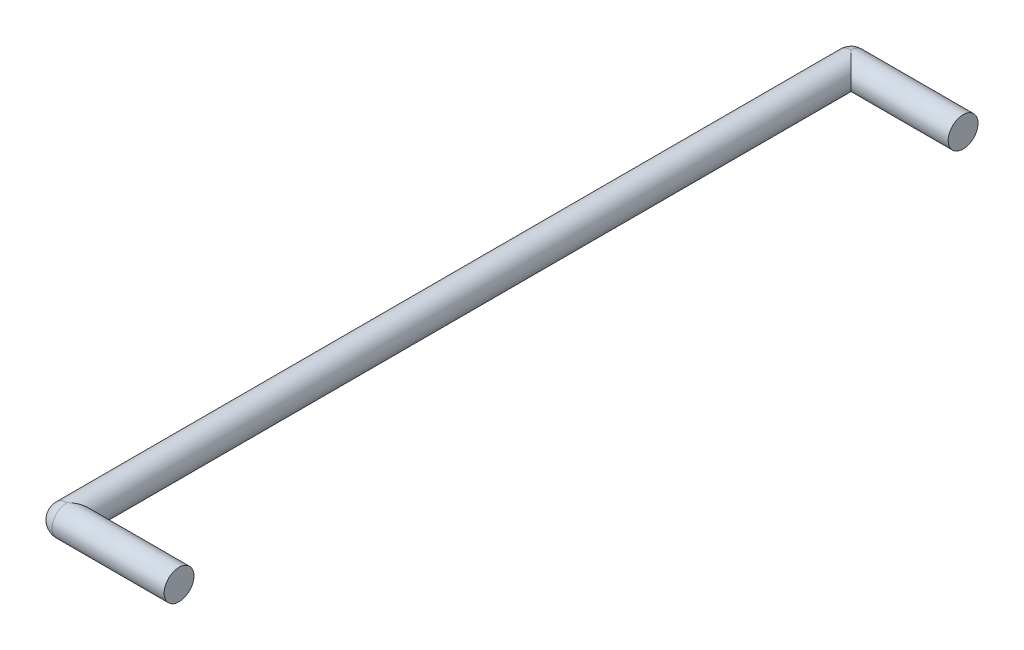
ISO-10303-21;
HEADER;
FILE_DESCRIPTION(('STEP AP214'),'2;1');
FILE_NAME('part.step','',(''),(''),'','','');
FILE_SCHEMA(('AUTOMOTIVE_DESIGN { 1 0 10303 214 1 1 1 1 }'));
ENDSEC;
DATA;
#1=APPLICATION_CONTEXT('core data for automotive mechanical design processes');
#2=APPLICATION_PROTOCOL_DEFINITION('international standard','automotive_design',2000,#1);
#3=PRODUCT_CONTEXT('',#1,'mechanical');
#4=PRODUCT('Part','Part','',(#3));
#5=PRODUCT_RELATED_PRODUCT_CATEGORY('part','',(#4));
#6=PRODUCT_DEFINITION_FORMATION('','',#4);
#7=PRODUCT_DEFINITION_CONTEXT('part definition',#1,'design');
#8=PRODUCT_DEFINITION('design','',#6,#7);
#9=PRODUCT_DEFINITION_SHAPE('','',#8);
#10=(LENGTH_UNIT() NAMED_UNIT(*) SI_UNIT(.MILLI.,.METRE.));
#11=(NAMED_UNIT(*) PLANE_ANGLE_UNIT() SI_UNIT($,.RADIAN.));
#12=(NAMED_UNIT(*) SI_UNIT($,.STERADIAN.) SOLID_ANGLE_UNIT());
#13=UNCERTAINTY_MEASURE_WITH_UNIT(LENGTH_MEASURE(1.E-05),#10,'distance_accuracy_value','');
#14=(GEOMETRIC_REPRESENTATION_CONTEXT(3) GLOBAL_UNCERTAINTY_ASSIGNED_CONTEXT((#13)) GLOBAL_UNIT_ASSIGNED_CONTEXT((#10,
#11,#12)) REPRESENTATION_CONTEXT('',''));
#15=CARTESIAN_POINT('',(0.,0.,0.));
#16=DIRECTION('',(0.,0.,1.));
#17=DIRECTION('',(1.,0.,0.));
#18=AXIS2_PLACEMENT_3D('',#15,#16,#17);
#19=CARTESIAN_POINT('',(3.,0.,0.));
#20=DIRECTION('',(1.,0.,0.));
#21=DIRECTION('',(0.,0.,-1.));
#22=AXIS2_PLACEMENT_3D('',#19,#20,#21);
#23=PLANE('',#22);
#24=CARTESIAN_POINT('',(3.,0.,0.));
#25=DIRECTION('',(-1.,0.,0.));
#26=DIRECTION('',(0.,0.,1.));
#27=AXIS2_PLACEMENT_3D('',#24,#25,#26);
#28=CIRCLE('',#27,0.4);
#29=CARTESIAN_POINT('',(3.,0.,0.4));
#30=VERTEX_POINT('',#29);
#31=EDGE_CURVE('E20',#30,#30,#28,.T.);
#32=ORIENTED_EDGE('',*,*,#31,.F.);
#33=EDGE_LOOP('',(#32));
#34=FACE_BOUND('',#33,.T.);
#35=ADVANCED_FACE('F17',(#34),#23,.T.);
#36=CARTESIAN_POINT('',(3.,0.,21.));
#37=DIRECTION('',(1.,0.,0.));
#38=DIRECTION('',(0.,0.,-1.));
#39=AXIS2_PLACEMENT_3D('',#36,#37,#38);
#40=PLANE('',#39);
#41=CARTESIAN_POINT('',(3.,0.,21.));
#42=DIRECTION('',(-1.,0.,0.));
#43=DIRECTION('',(0.,0.,1.));
#44=AXIS2_PLACEMENT_3D('',#41,#42,#43);
#45=CIRCLE('',#44,0.400000000000001);
#46=CARTESIAN_POINT('',(3.,0.,21.4));
#47=VERTEX_POINT('',#46);
#48=EDGE_CURVE('E60',#47,#47,#45,.T.);
#49=ORIENTED_EDGE('',*,*,#48,.F.);
#50=EDGE_LOOP('',(#49));
#51=FACE_BOUND('',#50,.T.);
#52=ADVANCED_FACE('F103',(#51),#40,.T.);
#53=CARTESIAN_POINT('',(3.,0.,0.));
#54=DIRECTION('',(-1.,0.,0.));
#55=DIRECTION('',(0.,0.,1.));
#56=AXIS2_PLACEMENT_3D('',#53,#54,#55);
#57=CYLINDRICAL_SURFACE('',#56,0.4);
#58=ORIENTED_EDGE('',*,*,#31,.T.);
#59=EDGE_LOOP('',(#58));
#60=FACE_BOUND('',#59,.T.);
#61=CARTESIAN_POINT('',(0.,0.,0.));
#62=DIRECTION('',(0.707106781186547,0.,-0.707106781186547));
#63=DIRECTION('',(-0.707106781186547,0.,-0.707106781186547));
#64=AXIS2_PLACEMENT_3D('',#61,#62,#63);
#65=ELLIPSE('',#64,0.565685424949238,0.4);
#66=CARTESIAN_POINT('',(0.,-0.4,0.));
#67=VERTEX_POINT('',#66);
#68=CARTESIAN_POINT('',(0.,0.4,0.));
#69=VERTEX_POINT('',#68);
#70=EDGE_CURVE('E55',#67,#69,#65,.F.);
#71=ORIENTED_EDGE('',*,*,#70,.F.);
#72=CARTESIAN_POINT('',(0.,0.,0.));
#73=DIRECTION('',(1.,0.,0.));
#74=DIRECTION('',(0.,1.,0.));
#75=AXIS2_PLACEMENT_3D('',#72,#73,#74);
#76=CIRCLE('',#75,0.4);
#77=EDGE_CURVE('E52',#69,#67,#76,.F.);
#78=ORIENTED_EDGE('',*,*,#77,.F.);
#79=EDGE_LOOP('',(#71,#78));
#80=FACE_BOUND('',#79,.T.);
#81=ADVANCED_FACE('F54',(#60,#80),#57,.T.);
#82=CARTESIAN_POINT('',(3.,0.,21.));
#83=DIRECTION('',(-1.,0.,0.));
#84=DIRECTION('',(0.,0.,1.));
#85=AXIS2_PLACEMENT_3D('',#82,#83,#84);
#86=CYLINDRICAL_SURFACE('',#85,0.400000000000001);
#87=CARTESIAN_POINT('',(0.,0.,21.));
#88=DIRECTION('',(1.,0.,0.));
#89=DIRECTION('',(0.,-1.,0.));
#90=AXIS2_PLACEMENT_3D('',#87,#88,#89);
#91=CIRCLE('',#90,0.400000000000001);
#92=CARTESIAN_POINT('',(0.,-0.400000000000001,21.));
#93=VERTEX_POINT('',#92);
#94=CARTESIAN_POINT('',(0.,0.400000000000001,21.));
#95=VERTEX_POINT('',#94);
#96=EDGE_CURVE('E48',#93,#95,#91,.F.);
#97=ORIENTED_EDGE('',*,*,#96,.F.);
#98=CARTESIAN_POINT('',(0.,0.,21.));
#99=DIRECTION('',(-0.707106781186547,0.,-0.707106781186547));
#100=DIRECTION('',(-0.707106781186547,0.,0.707106781186547));
#101=AXIS2_PLACEMENT_3D('',#98,#99,#100);
#102=ELLIPSE('',#101,0.565685424949239,0.400000000000001);
#103=EDGE_CURVE('E67',#95,#93,#102,.T.);
#104=ORIENTED_EDGE('',*,*,#103,.F.);
#105=EDGE_LOOP('',(#97,#104));
#106=FACE_BOUND('',#105,.T.);
#107=ORIENTED_EDGE('',*,*,#48,.T.);
#108=EDGE_LOOP('',(#107));
#109=FACE_BOUND('',#108,.T.);
#110=ADVANCED_FACE('F87',(#106,#109),#86,.T.);
#111=CARTESIAN_POINT('',(0.,0.,0.));
#112=DIRECTION('',(1.,0.,0.));
#113=DIRECTION('',(0.,1.,0.));
#114=AXIS2_PLACEMENT_3D('',#111,#112,#113);
#115=SPHERICAL_SURFACE('',#114,0.4);
#116=ORIENTED_EDGE('',*,*,#77,.T.);
#117=CARTESIAN_POINT('',(0.,0.,0.));
#118=DIRECTION('',(0.,0.,-1.));
#119=DIRECTION('',(-1.,0.,0.));
#120=AXIS2_PLACEMENT_3D('',#117,#118,#119);
#121=CIRCLE('',#120,0.4);
#122=CARTESIAN_POINT('',(-0.4,0.,0.));
#123=VERTEX_POINT('',#122);
#124=EDGE_CURVE('E59',#123,#67,#121,.F.);
#125=ORIENTED_EDGE('',*,*,#124,.F.);
#126=CARTESIAN_POINT('',(0.,0.,0.));
#127=DIRECTION('',(0.,0.,-1.));
#128=DIRECTION('',(-1.,0.,0.));
#129=AXIS2_PLACEMENT_3D('',#126,#127,#128);
#130=CIRCLE('',#129,0.4);
#131=EDGE_CURVE('E26',#69,#123,#130,.F.);
#132=ORIENTED_EDGE('',*,*,#131,.F.);
#133=EDGE_LOOP('',(#116,#125,#132));
#134=FACE_BOUND('',#133,.T.);
#135=ADVANCED_FACE('F66',(#134),#115,.T.);
#136=CARTESIAN_POINT('',(0.,0.,21.));
#137=DIRECTION('',(1.,0.,0.));
#138=DIRECTION('',(0.,-1.,0.));
#139=AXIS2_PLACEMENT_3D('',#136,#137,#138);
#140=SPHERICAL_SURFACE('',#139,0.400000000000001);
#141=CARTESIAN_POINT('',(0.,0.,21.));
#142=DIRECTION('',(0.,0.,-1.));
#143=DIRECTION('',(1.,0.,0.));
#144=AXIS2_PLACEMENT_3D('',#141,#142,#143);
#145=CIRCLE('',#144,0.400000000000001);
#146=CARTESIAN_POINT('',(-0.400000000000001,0.,21.));
#147=VERTEX_POINT('',#146);
#148=EDGE_CURVE('E34',#147,#93,#145,.F.);
#149=ORIENTED_EDGE('',*,*,#148,.T.);
#150=ORIENTED_EDGE('',*,*,#96,.T.);
#151=CARTESIAN_POINT('',(0.,0.,21.));
#152=DIRECTION('',(0.,0.,-1.));
#153=DIRECTION('',(-1.,0.,0.));
#154=AXIS2_PLACEMENT_3D('',#151,#152,#153);
#155=CIRCLE('',#154,0.4);
#156=EDGE_CURVE('E11',#147,#95,#155,.T.);
#157=ORIENTED_EDGE('',*,*,#156,.F.);
#158=EDGE_LOOP('',(#149,#150,#157));
#159=FACE_BOUND('',#158,.T.);
#160=ADVANCED_FACE('F79',(#159),#140,.T.);
#161=CARTESIAN_POINT('',(0.,0.,21.));
#162=DIRECTION('',(0.,0.,-1.));
#163=DIRECTION('',(-1.,0.,0.));
#164=AXIS2_PLACEMENT_3D('',#161,#162,#163);
#165=CYLINDRICAL_SURFACE('',#164,0.4);
#166=ORIENTED_EDGE('',*,*,#70,.T.);
#167=ORIENTED_EDGE('',*,*,#131,.T.);
#168=ORIENTED_EDGE('',*,*,#124,.T.);
#169=EDGE_LOOP('',(#166,#167,#168));
#170=FACE_BOUND('',#169,.T.);
#171=ORIENTED_EDGE('',*,*,#103,.T.);
#172=ORIENTED_EDGE('',*,*,#148,.F.);
#173=ORIENTED_EDGE('',*,*,#156,.T.);
#174=EDGE_LOOP('',(#171,#172,#173));
#175=FACE_BOUND('',#174,.T.);
#176=ADVANCED_FACE('F64',(#170,#175),#165,.T.);
#177=CLOSED_SHELL('',(#35,#52,#81,#110,#135,#160,#176));
#178=MANIFOLD_SOLID_BREP('B1',#177);
#179=ADVANCED_BREP_SHAPE_REPRESENTATION('',(#18,#178),#14);
#180=SHAPE_DEFINITION_REPRESENTATION(#9,#179);
ENDSEC;
END-ISO-10303-21;
